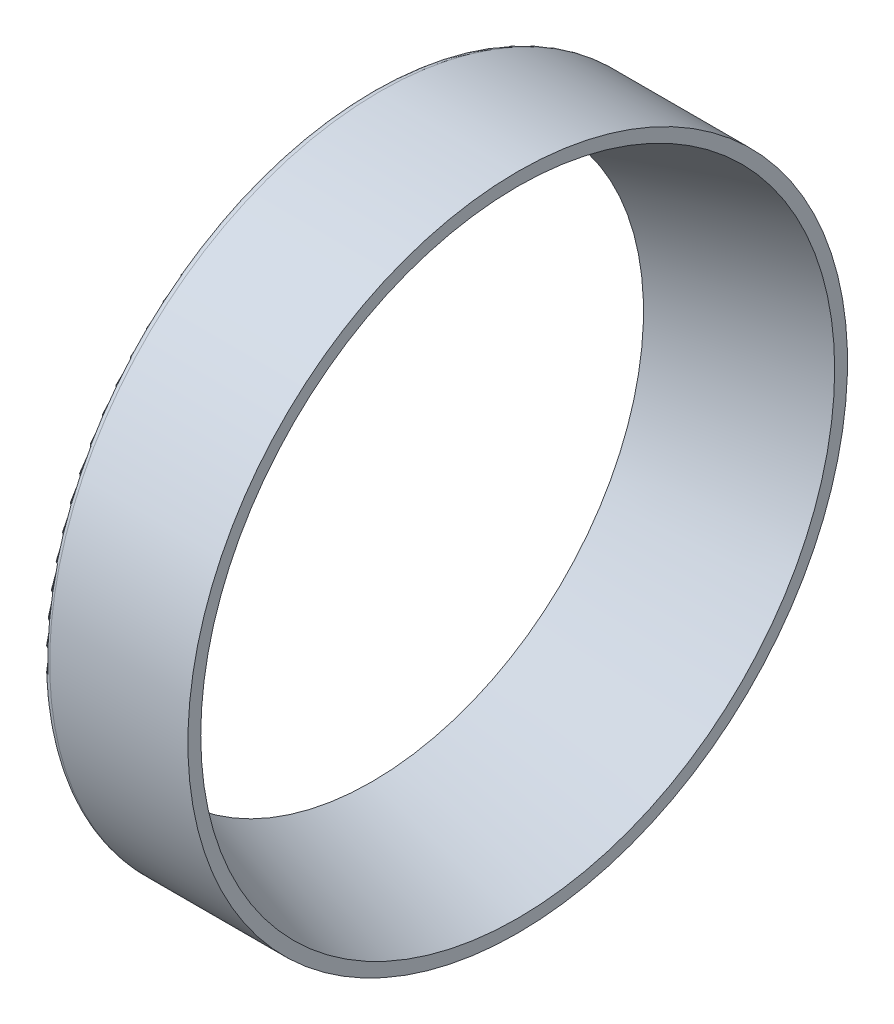
ISO-10303-21;
HEADER;
FILE_DESCRIPTION(('STEP AP214'),'2;1');
FILE_NAME('part.step','',(''),(''),'','','');
FILE_SCHEMA(('AUTOMOTIVE_DESIGN { 1 0 10303 214 1 1 1 1 }'));
ENDSEC;
DATA;
#1=APPLICATION_CONTEXT('core data for automotive mechanical design processes');
#2=APPLICATION_PROTOCOL_DEFINITION('international standard','automotive_design',2000,#1);
#3=PRODUCT_CONTEXT('',#1,'mechanical');
#4=PRODUCT('Part','Part','',(#3));
#5=PRODUCT_RELATED_PRODUCT_CATEGORY('part','',(#4));
#6=PRODUCT_DEFINITION_FORMATION('','',#4);
#7=PRODUCT_DEFINITION_CONTEXT('part definition',#1,'design');
#8=PRODUCT_DEFINITION('design','',#6,#7);
#9=PRODUCT_DEFINITION_SHAPE('','',#8);
#10=(LENGTH_UNIT() NAMED_UNIT(*) SI_UNIT(.MILLI.,.METRE.));
#11=(NAMED_UNIT(*) PLANE_ANGLE_UNIT() SI_UNIT($,.RADIAN.));
#12=(NAMED_UNIT(*) SI_UNIT($,.STERADIAN.) SOLID_ANGLE_UNIT());
#13=UNCERTAINTY_MEASURE_WITH_UNIT(LENGTH_MEASURE(1.E-05),#10,'distance_accuracy_value','');
#14=(GEOMETRIC_REPRESENTATION_CONTEXT(3) GLOBAL_UNCERTAINTY_ASSIGNED_CONTEXT((#13)) GLOBAL_UNIT_ASSIGNED_CONTEXT((#10,
#11,#12)) REPRESENTATION_CONTEXT('',''));
#15=CARTESIAN_POINT('',(0.,0.,0.));
#16=DIRECTION('',(0.,0.,1.));
#17=DIRECTION('',(1.,0.,0.));
#18=AXIS2_PLACEMENT_3D('',#15,#16,#17);
#19=CARTESIAN_POINT('',(-5.19711940856268,23.5,0.));
#20=DIRECTION('',(1.,0.,0.));
#21=DIRECTION('',(0.,1.,0.));
#22=AXIS2_PLACEMENT_3D('',#19,#20,#21);
#23=PLANE('',#22);
#24=CARTESIAN_POINT('',(-5.19711940856268,-2.5,0.));
#25=DIRECTION('',(1.,0.,0.));
#26=DIRECTION('',(0.,1.,0.));
#27=AXIS2_PLACEMENT_3D('',#24,#25,#26);
#28=CIRCLE('',#27,26.);
#29=CARTESIAN_POINT('',(-5.19711940856268,23.5,0.));
#30=VERTEX_POINT('',#29);
#31=EDGE_CURVE('E50',#30,#30,#28,.T.);
#32=ORIENTED_EDGE('',*,*,#31,.T.);
#33=EDGE_LOOP('',(#32));
#34=FACE_BOUND('',#33,.T.);
#35=CARTESIAN_POINT('',(-5.19711940856268,-2.5,0.));
#36=DIRECTION('',(1.,0.,0.));
#37=DIRECTION('',(0.,1.,0.));
#38=AXIS2_PLACEMENT_3D('',#35,#36,#37);
#39=CIRCLE('',#38,24.9879467704712);
#40=CARTESIAN_POINT('',(-5.19711940856268,22.4879467704712,0.));
#41=VERTEX_POINT('',#40);
#42=EDGE_CURVE('E10',#41,#41,#39,.T.);
#43=ORIENTED_EDGE('',*,*,#42,.F.);
#44=EDGE_LOOP('',(#43));
#45=FACE_BOUND('',#44,.T.);
#46=ADVANCED_FACE('F31',(#34,#45),#23,.T.);
#47=CARTESIAN_POINT('',(-16.6971194085627,-2.5,0.));
#48=DIRECTION('',(1.,0.,0.));
#49=DIRECTION('',(0.,1.,0.));
#50=AXIS2_PLACEMENT_3D('',#47,#48,#49);
#51=CONICAL_SURFACE('',#50,21.4172616977049,0.301056618872125);
#52=ORIENTED_EDGE('',*,*,#42,.T.);
#53=EDGE_LOOP('',(#52));
#54=FACE_BOUND('',#53,.T.);
#55=CARTESIAN_POINT('',(-16.6971194085627,-2.5,0.));
#56=DIRECTION('',(1.,0.,0.));
#57=DIRECTION('',(0.,1.,0.));
#58=AXIS2_PLACEMENT_3D('',#55,#56,#57);
#59=CIRCLE('',#58,21.4172616977049);
#60=CARTESIAN_POINT('',(-16.6971194085627,18.9172616977049,0.));
#61=VERTEX_POINT('',#60);
#62=EDGE_CURVE('E37',#61,#61,#59,.T.);
#63=ORIENTED_EDGE('',*,*,#62,.F.);
#64=EDGE_LOOP('',(#63));
#65=FACE_BOUND('',#64,.T.);
#66=ADVANCED_FACE('F68',(#54,#65),#51,.F.);
#67=CARTESIAN_POINT('',(-16.6971194085627,22.9,0.));
#68=DIRECTION('',(-1.,0.,0.));
#69=DIRECTION('',(0.,-1.,0.));
#70=AXIS2_PLACEMENT_3D('',#67,#68,#69);
#71=PLANE('',#70);
#72=ORIENTED_EDGE('',*,*,#62,.T.);
#73=EDGE_LOOP('',(#72));
#74=FACE_BOUND('',#73,.T.);
#75=CARTESIAN_POINT('',(-16.6971194085627,-2.5,0.));
#76=DIRECTION('',(1.,0.,0.));
#77=DIRECTION('',(0.,1.,0.));
#78=AXIS2_PLACEMENT_3D('',#75,#76,#77);
#79=CIRCLE('',#78,25.4);
#80=CARTESIAN_POINT('',(-16.6971194085627,22.9,0.));
#81=VERTEX_POINT('',#80);
#82=EDGE_CURVE('E41',#81,#81,#79,.T.);
#83=ORIENTED_EDGE('',*,*,#82,.F.);
#84=EDGE_LOOP('',(#83));
#85=FACE_BOUND('',#84,.T.);
#86=ADVANCED_FACE('F64',(#74,#85),#71,.T.);
#87=CARTESIAN_POINT('',(-16.0971194085627,-2.5,0.));
#88=DIRECTION('',(1.,0.,0.));
#89=DIRECTION('',(0.,1.,0.));
#90=AXIS2_PLACEMENT_3D('',#87,#88,#89);
#91=TOROIDAL_SURFACE('',#90,25.4,0.6);
#92=ORIENTED_EDGE('',*,*,#82,.T.);
#93=EDGE_LOOP('',(#92));
#94=FACE_BOUND('',#93,.T.);
#95=CARTESIAN_POINT('',(-16.0971194085627,-2.5,0.));
#96=DIRECTION('',(1.,0.,0.));
#97=DIRECTION('',(0.,1.,0.));
#98=AXIS2_PLACEMENT_3D('',#95,#96,#97);
#99=CIRCLE('',#98,26.);
#100=CARTESIAN_POINT('',(-16.0971194085627,23.5,0.));
#101=VERTEX_POINT('',#100);
#102=EDGE_CURVE('E45',#101,#101,#99,.T.);
#103=ORIENTED_EDGE('',*,*,#102,.F.);
#104=EDGE_LOOP('',(#103));
#105=FACE_BOUND('',#104,.T.);
#106=ADVANCED_FACE('F58',(#94,#105),#91,.T.);
#107=CARTESIAN_POINT('',(0.,-2.5,0.));
#108=DIRECTION('',(1.,0.,0.));
#109=DIRECTION('',(0.,1.,0.));
#110=AXIS2_PLACEMENT_3D('',#107,#108,#109);
#111=CYLINDRICAL_SURFACE('',#110,26.);
#112=ORIENTED_EDGE('',*,*,#102,.T.);
#113=EDGE_LOOP('',(#112));
#114=FACE_BOUND('',#113,.T.);
#115=ORIENTED_EDGE('',*,*,#31,.F.);
#116=EDGE_LOOP('',(#115));
#117=FACE_BOUND('',#116,.T.);
#118=ADVANCED_FACE('F56',(#114,#117),#111,.T.);
#119=CLOSED_SHELL('',(#46,#66,#86,#106,#118));
#120=MANIFOLD_SOLID_BREP('B2',#119);
#121=ADVANCED_BREP_SHAPE_REPRESENTATION('',(#18,#120),#14);
#122=SHAPE_DEFINITION_REPRESENTATION(#9,#121);
ENDSEC;
END-ISO-10303-21;
